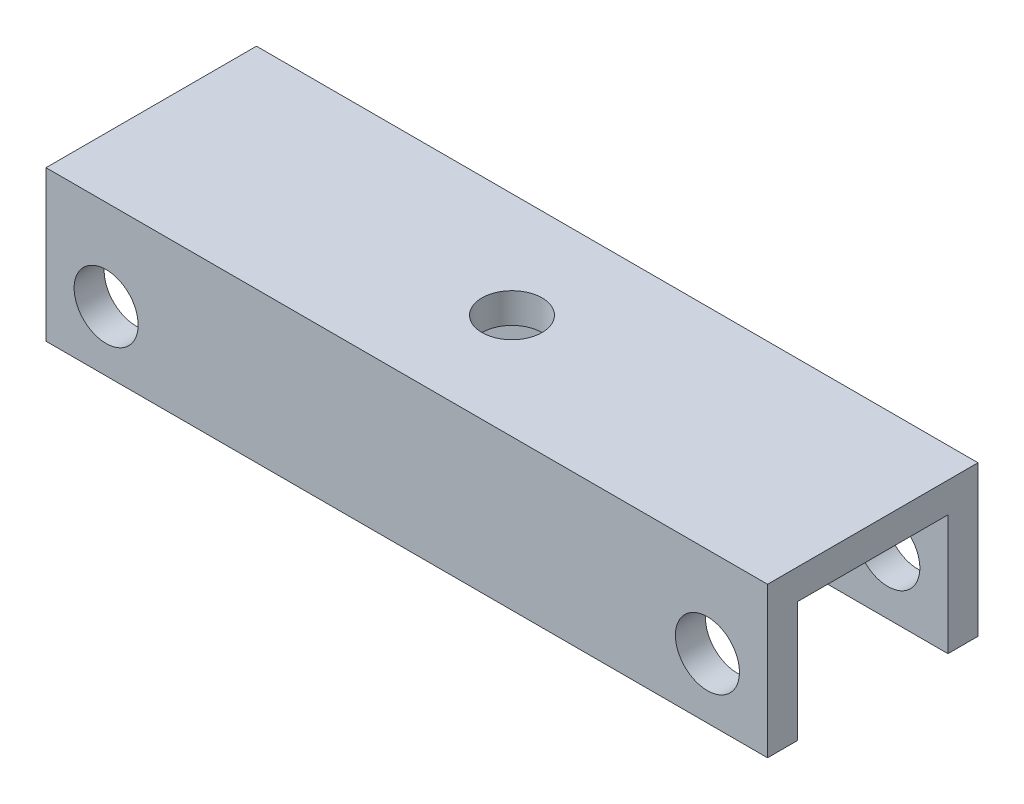
ISO-10303-21;
HEADER;
FILE_DESCRIPTION(('STEP AP214'),'2;1');
FILE_NAME('part.step','',(''),(''),'','','');
FILE_SCHEMA(('AUTOMOTIVE_DESIGN { 1 0 10303 214 1 1 1 1 }'));
ENDSEC;
DATA;
#1=APPLICATION_CONTEXT('core data for automotive mechanical design processes');
#2=APPLICATION_PROTOCOL_DEFINITION('international standard','automotive_design',2000,#1);
#3=PRODUCT_CONTEXT('',#1,'mechanical');
#4=PRODUCT('Part','Part','',(#3));
#5=PRODUCT_RELATED_PRODUCT_CATEGORY('part','',(#4));
#6=PRODUCT_DEFINITION_FORMATION('','',#4);
#7=PRODUCT_DEFINITION_CONTEXT('part definition',#1,'design');
#8=PRODUCT_DEFINITION('design','',#6,#7);
#9=PRODUCT_DEFINITION_SHAPE('','',#8);
#10=(LENGTH_UNIT() NAMED_UNIT(*) SI_UNIT(.MILLI.,.METRE.));
#11=(NAMED_UNIT(*) PLANE_ANGLE_UNIT() SI_UNIT($,.RADIAN.));
#12=(NAMED_UNIT(*) SI_UNIT($,.STERADIAN.) SOLID_ANGLE_UNIT());
#13=UNCERTAINTY_MEASURE_WITH_UNIT(LENGTH_MEASURE(1.E-05),#10,'distance_accuracy_value','');
#14=(GEOMETRIC_REPRESENTATION_CONTEXT(3) GLOBAL_UNCERTAINTY_ASSIGNED_CONTEXT((#13)) GLOBAL_UNIT_ASSIGNED_CONTEXT((#10,
#11,#12)) REPRESENTATION_CONTEXT('',''));
#15=CARTESIAN_POINT('',(0.,0.,0.));
#16=DIRECTION('',(0.,0.,1.));
#17=DIRECTION('',(1.,0.,0.));
#18=AXIS2_PLACEMENT_3D('',#15,#16,#17);
#19=CARTESIAN_POINT('',(152.4,-31.75,35.0487043256437));
#20=DIRECTION('',(0.,0.,-1.));
#21=DIRECTION('',(-1.,0.,0.));
#22=AXIS2_PLACEMENT_3D('',#19,#20,#21);
#23=PLANE('',#22);
#24=CARTESIAN_POINT('',(139.7,-19.05,35.0487043256437));
#25=DIRECTION('',(0.,0.,1.));
#26=DIRECTION('',(-1.,0.,0.));
#27=AXIS2_PLACEMENT_3D('',#24,#25,#26);
#28=CIRCLE('',#27,6.76325482614574);
#29=CARTESIAN_POINT('',(132.936745173854,-19.05,35.0487043256437));
#30=VERTEX_POINT('',#29);
#31=EDGE_CURVE('E200',#30,#30,#28,.T.);
#32=ORIENTED_EDGE('',*,*,#31,.F.);
#33=EDGE_LOOP('',(#32));
#34=FACE_BOUND('',#33,.T.);
#35=CARTESIAN_POINT('',(12.7,-19.05,35.0487043256437));
#36=DIRECTION('',(0.,0.,1.));
#37=DIRECTION('',(1.,0.,0.));
#38=AXIS2_PLACEMENT_3D('',#35,#36,#37);
#39=CIRCLE('',#38,6.76325482614575);
#40=CARTESIAN_POINT('',(19.4632548261458,-19.05,35.0487043256437));
#41=VERTEX_POINT('',#40);
#42=EDGE_CURVE('E188',#41,#41,#39,.T.);
#43=ORIENTED_EDGE('',*,*,#42,.F.);
#44=EDGE_LOOP('',(#43));
#45=FACE_BOUND('',#44,.T.);
#46=DIRECTION('',(0.,-1.,0.));
#47=VECTOR('',#46,1.);
#48=CARTESIAN_POINT('',(0.,-31.75,35.0487043256437));
#49=LINE('',#48,#47);
#50=CARTESIAN_POINT('',(0.,0.,35.0487043256437));
#51=VERTEX_POINT('',#50);
#52=CARTESIAN_POINT('',(0.,-31.75,35.0487043256437));
#53=VERTEX_POINT('',#52);
#54=EDGE_CURVE('E128',#51,#53,#49,.T.);
#55=ORIENTED_EDGE('',*,*,#54,.T.);
#56=DIRECTION('',(-1.,0.,0.));
#57=VECTOR('',#56,1.);
#58=CARTESIAN_POINT('',(152.4,-31.75,35.0487043256437));
#59=LINE('',#58,#57);
#60=CARTESIAN_POINT('',(152.4,-31.75,35.0487043256437));
#61=VERTEX_POINT('',#60);
#62=EDGE_CURVE('E11',#61,#53,#59,.T.);
#63=ORIENTED_EDGE('',*,*,#62,.F.);
#64=DIRECTION('',(0.,-1.,0.));
#65=VECTOR('',#64,1.);
#66=CARTESIAN_POINT('',(152.4,-31.75,35.0487043256437));
#67=LINE('',#66,#65);
#68=CARTESIAN_POINT('',(152.4,0.,35.0487043256437));
#69=VERTEX_POINT('',#68);
#70=EDGE_CURVE('E143',#69,#61,#67,.T.);
#71=ORIENTED_EDGE('',*,*,#70,.F.);
#72=DIRECTION('',(-1.,0.,0.));
#73=VECTOR('',#72,1.);
#74=CARTESIAN_POINT('',(152.4,0.,35.0487043256437));
#75=LINE('',#74,#73);
#76=EDGE_CURVE('E124',#69,#51,#75,.T.);
#77=ORIENTED_EDGE('',*,*,#76,.T.);
#78=EDGE_LOOP('',(#55,#63,#71,#77));
#79=FACE_BOUND('',#78,.T.);
#80=ADVANCED_FACE('F32',(#34,#45,#79),#23,.F.);
#81=CARTESIAN_POINT('',(152.4,-31.75,28.6987043256437));
#82=DIRECTION('',(0.,1.,0.));
#83=DIRECTION('',(0.,0.,1.));
#84=AXIS2_PLACEMENT_3D('',#81,#82,#83);
#85=PLANE('',#84);
#86=DIRECTION('',(0.,0.,-1.));
#87=VECTOR('',#86,1.);
#88=CARTESIAN_POINT('',(0.,-31.75,28.6987043256437));
#89=LINE('',#88,#87);
#90=CARTESIAN_POINT('',(0.,-31.75,28.6987043256437));
#91=VERTEX_POINT('',#90);
#92=EDGE_CURVE('E131',#53,#91,#89,.T.);
#93=ORIENTED_EDGE('',*,*,#92,.T.);
#94=DIRECTION('',(-1.,0.,0.));
#95=VECTOR('',#94,1.);
#96=CARTESIAN_POINT('',(152.4,-31.75,28.6987043256437));
#97=LINE('',#96,#95);
#98=CARTESIAN_POINT('',(152.4,-31.75,28.6987043256437));
#99=VERTEX_POINT('',#98);
#100=EDGE_CURVE('E40',#99,#91,#97,.T.);
#101=ORIENTED_EDGE('',*,*,#100,.F.);
#102=DIRECTION('',(0.,0.,-1.));
#103=VECTOR('',#102,1.);
#104=CARTESIAN_POINT('',(152.4,-31.75,28.6987043256437));
#105=LINE('',#104,#103);
#106=EDGE_CURVE('E91',#61,#99,#105,.T.);
#107=ORIENTED_EDGE('',*,*,#106,.F.);
#108=ORIENTED_EDGE('',*,*,#62,.T.);
#109=EDGE_LOOP('',(#93,#101,#107,#108));
#110=FACE_BOUND('',#109,.T.);
#111=ADVANCED_FACE('F235',(#110),#85,.F.);
#112=CARTESIAN_POINT('',(152.4,-6.35,28.6987043256437));
#113=DIRECTION('',(0.,0.,1.));
#114=DIRECTION('',(1.,0.,0.));
#115=AXIS2_PLACEMENT_3D('',#112,#113,#114);
#116=PLANE('',#115);
#117=CARTESIAN_POINT('',(139.7,-19.05,28.6987043256437));
#118=DIRECTION('',(0.,0.,1.));
#119=DIRECTION('',(1.,0.,0.));
#120=AXIS2_PLACEMENT_3D('',#117,#118,#119);
#121=CIRCLE('',#120,6.76325482614574);
#122=CARTESIAN_POINT('',(146.463254826146,-19.05,28.6987043256437));
#123=VERTEX_POINT('',#122);
#124=EDGE_CURVE('E191',#123,#123,#121,.T.);
#125=ORIENTED_EDGE('',*,*,#124,.T.);
#126=EDGE_LOOP('',(#125));
#127=FACE_BOUND('',#126,.T.);
#128=CARTESIAN_POINT('',(12.7,-19.05,28.6987043256437));
#129=DIRECTION('',(0.,0.,1.));
#130=DIRECTION('',(1.,0.,0.));
#131=AXIS2_PLACEMENT_3D('',#128,#129,#130);
#132=CIRCLE('',#131,6.76325482614575);
#133=CARTESIAN_POINT('',(19.4632548261458,-19.05,28.6987043256437));
#134=VERTEX_POINT('',#133);
#135=EDGE_CURVE('E181',#134,#134,#132,.T.);
#136=ORIENTED_EDGE('',*,*,#135,.T.);
#137=EDGE_LOOP('',(#136));
#138=FACE_BOUND('',#137,.T.);
#139=DIRECTION('',(0.,1.,0.));
#140=VECTOR('',#139,1.);
#141=CARTESIAN_POINT('',(0.,-6.35,28.6987043256437));
#142=LINE('',#141,#140);
#143=CARTESIAN_POINT('',(0.,-6.35,28.6987043256437));
#144=VERTEX_POINT('',#143);
#145=EDGE_CURVE('E134',#91,#144,#142,.T.);
#146=ORIENTED_EDGE('',*,*,#145,.T.);
#147=DIRECTION('',(-1.,0.,0.));
#148=VECTOR('',#147,1.);
#149=CARTESIAN_POINT('',(152.4,-6.35,28.6987043256437));
#150=LINE('',#149,#148);
#151=CARTESIAN_POINT('',(152.4,-6.35,28.6987043256437));
#152=VERTEX_POINT('',#151);
#153=EDGE_CURVE('E150',#152,#144,#150,.T.);
#154=ORIENTED_EDGE('',*,*,#153,.F.);
#155=DIRECTION('',(0.,1.,0.));
#156=VECTOR('',#155,1.);
#157=CARTESIAN_POINT('',(152.4,-6.35,28.6987043256437));
#158=LINE('',#157,#156);
#159=EDGE_CURVE('E158',#99,#152,#158,.T.);
#160=ORIENTED_EDGE('',*,*,#159,.F.);
#161=ORIENTED_EDGE('',*,*,#100,.T.);
#162=EDGE_LOOP('',(#146,#154,#160,#161));
#163=FACE_BOUND('',#162,.T.);
#164=ADVANCED_FACE('F156',(#127,#138,#163),#116,.F.);
#165=CARTESIAN_POINT('',(152.4,-6.35,-3.05129567435631));
#166=DIRECTION('',(0.,1.,0.));
#167=DIRECTION('',(0.,0.,1.));
#168=AXIS2_PLACEMENT_3D('',#165,#166,#167);
#169=PLANE('',#168);
#170=CARTESIAN_POINT('',(76.2,-6.35,12.8237043256437));
#171=DIRECTION('',(0.,1.,0.));
#172=DIRECTION('',(0.,0.,1.));
#173=AXIS2_PLACEMENT_3D('',#170,#171,#172);
#174=CIRCLE('',#173,6.35);
#175=CARTESIAN_POINT('',(76.2,-6.35000000000001,19.1737043256437));
#176=VERTEX_POINT('',#175);
#177=EDGE_CURVE('E132',#176,#176,#174,.F.);
#178=ORIENTED_EDGE('',*,*,#177,.F.);
#179=EDGE_LOOP('',(#178));
#180=FACE_BOUND('',#179,.T.);
#181=DIRECTION('',(0.,0.,-1.));
#182=VECTOR('',#181,1.);
#183=CARTESIAN_POINT('',(0.,-6.35,-3.05129567435631));
#184=LINE('',#183,#182);
#185=CARTESIAN_POINT('',(0.,-6.35,-3.05129567435631));
#186=VERTEX_POINT('',#185);
#187=EDGE_CURVE('E136',#144,#186,#184,.T.);
#188=ORIENTED_EDGE('',*,*,#187,.T.);
#189=DIRECTION('',(-1.,0.,0.));
#190=VECTOR('',#189,1.);
#191=CARTESIAN_POINT('',(152.4,-6.35,-3.05129567435631));
#192=LINE('',#191,#190);
#193=CARTESIAN_POINT('',(152.4,-6.35,-3.05129567435631));
#194=VERTEX_POINT('',#193);
#195=EDGE_CURVE('E147',#194,#186,#192,.T.);
#196=ORIENTED_EDGE('',*,*,#195,.F.);
#197=DIRECTION('',(0.,0.,-1.));
#198=VECTOR('',#197,1.);
#199=CARTESIAN_POINT('',(152.4,-6.35,-3.05129567435631));
#200=LINE('',#199,#198);
#201=EDGE_CURVE('E170',#152,#194,#200,.T.);
#202=ORIENTED_EDGE('',*,*,#201,.F.);
#203=ORIENTED_EDGE('',*,*,#153,.T.);
#204=EDGE_LOOP('',(#188,#196,#202,#203));
#205=FACE_BOUND('',#204,.T.);
#206=ADVANCED_FACE('F166',(#180,#205),#169,.F.);
#207=CARTESIAN_POINT('',(152.4,-31.75,-3.05129567435631));
#208=DIRECTION('',(0.,0.,-1.));
#209=DIRECTION('',(-1.,0.,0.));
#210=AXIS2_PLACEMENT_3D('',#207,#208,#209);
#211=PLANE('',#210);
#212=CARTESIAN_POINT('',(139.7,-19.05,-3.05129567435631));
#213=DIRECTION('',(0.,0.,-1.));
#214=DIRECTION('',(-1.,0.,0.));
#215=AXIS2_PLACEMENT_3D('',#212,#213,#214);
#216=CIRCLE('',#215,6.76325482614574);
#217=CARTESIAN_POINT('',(132.936745173854,-19.05,-3.05129567435631));
#218=VERTEX_POINT('',#217);
#219=EDGE_CURVE('E196',#218,#218,#216,.T.);
#220=ORIENTED_EDGE('',*,*,#219,.T.);
#221=EDGE_LOOP('',(#220));
#222=FACE_BOUND('',#221,.T.);
#223=CARTESIAN_POINT('',(12.7,-19.05,-3.05129567435631));
#224=DIRECTION('',(0.,0.,-1.));
#225=DIRECTION('',(-1.,0.,0.));
#226=AXIS2_PLACEMENT_3D('',#223,#224,#225);
#227=CIRCLE('',#226,6.76325482614575);
#228=CARTESIAN_POINT('',(5.93674517385425,-19.05,-3.05129567435631));
#229=VERTEX_POINT('',#228);
#230=EDGE_CURVE('E184',#229,#229,#227,.T.);
#231=ORIENTED_EDGE('',*,*,#230,.T.);
#232=EDGE_LOOP('',(#231));
#233=FACE_BOUND('',#232,.T.);
#234=DIRECTION('',(0.,-1.,0.));
#235=VECTOR('',#234,1.);
#236=CARTESIAN_POINT('',(0.,-31.75,-3.05129567435631));
#237=LINE('',#236,#235);
#238=CARTESIAN_POINT('',(0.,-31.75,-3.05129567435631));
#239=VERTEX_POINT('',#238);
#240=EDGE_CURVE('E138',#186,#239,#237,.T.);
#241=ORIENTED_EDGE('',*,*,#240,.T.);
#242=DIRECTION('',(-1.,0.,0.));
#243=VECTOR('',#242,1.);
#244=CARTESIAN_POINT('',(152.4,-31.75,-3.05129567435631));
#245=LINE('',#244,#243);
#246=CARTESIAN_POINT('',(152.4,-31.75,-3.05129567435631));
#247=VERTEX_POINT('',#246);
#248=EDGE_CURVE('E119',#247,#239,#245,.T.);
#249=ORIENTED_EDGE('',*,*,#248,.F.);
#250=DIRECTION('',(0.,-1.,0.));
#251=VECTOR('',#250,1.);
#252=CARTESIAN_POINT('',(152.4,-31.75,-3.05129567435631));
#253=LINE('',#252,#251);
#254=EDGE_CURVE('E110',#194,#247,#253,.T.);
#255=ORIENTED_EDGE('',*,*,#254,.F.);
#256=ORIENTED_EDGE('',*,*,#195,.T.);
#257=EDGE_LOOP('',(#241,#249,#255,#256));
#258=FACE_BOUND('',#257,.T.);
#259=ADVANCED_FACE('F169',(#222,#233,#258),#211,.F.);
#260=CARTESIAN_POINT('',(152.4,-31.75,-9.40129567435631));
#261=DIRECTION('',(0.,1.,0.));
#262=DIRECTION('',(0.,0.,1.));
#263=AXIS2_PLACEMENT_3D('',#260,#261,#262);
#264=PLANE('',#263);
#265=DIRECTION('',(0.,0.,-1.));
#266=VECTOR('',#265,1.);
#267=CARTESIAN_POINT('',(0.,-31.75,-9.40129567435631));
#268=LINE('',#267,#266);
#269=CARTESIAN_POINT('',(0.,-31.75,-9.40129567435631));
#270=VERTEX_POINT('',#269);
#271=EDGE_CURVE('E118',#239,#270,#268,.T.);
#272=ORIENTED_EDGE('',*,*,#271,.T.);
#273=DIRECTION('',(-1.,0.,0.));
#274=VECTOR('',#273,1.);
#275=CARTESIAN_POINT('',(152.4,-31.75,-9.40129567435631));
#276=LINE('',#275,#274);
#277=CARTESIAN_POINT('',(152.4,-31.75,-9.40129567435631));
#278=VERTEX_POINT('',#277);
#279=EDGE_CURVE('E115',#278,#270,#276,.T.);
#280=ORIENTED_EDGE('',*,*,#279,.F.);
#281=DIRECTION('',(0.,0.,-1.));
#282=VECTOR('',#281,1.);
#283=CARTESIAN_POINT('',(152.4,-31.75,-9.40129567435631));
#284=LINE('',#283,#282);
#285=EDGE_CURVE('E104',#247,#278,#284,.T.);
#286=ORIENTED_EDGE('',*,*,#285,.F.);
#287=ORIENTED_EDGE('',*,*,#248,.T.);
#288=EDGE_LOOP('',(#272,#280,#286,#287));
#289=FACE_BOUND('',#288,.T.);
#290=ADVANCED_FACE('F116',(#289),#264,.F.);
#291=CARTESIAN_POINT('',(152.4,0.,-9.4012956743563));
#292=DIRECTION('',(0.,0.,1.));
#293=DIRECTION('',(0.,-1.,0.));
#294=AXIS2_PLACEMENT_3D('',#291,#292,#293);
#295=PLANE('',#294);
#296=CARTESIAN_POINT('',(139.7,-19.05,-9.40129567435631));
#297=DIRECTION('',(0.,0.,1.));
#298=DIRECTION('',(-1.,0.,0.));
#299=AXIS2_PLACEMENT_3D('',#296,#297,#298);
#300=CIRCLE('',#299,6.76325482614574);
#301=CARTESIAN_POINT('',(132.936745173854,-19.05,-9.40129567435631));
#302=VERTEX_POINT('',#301);
#303=EDGE_CURVE('E199',#302,#302,#300,.T.);
#304=ORIENTED_EDGE('',*,*,#303,.T.);
#305=EDGE_LOOP('',(#304));
#306=FACE_BOUND('',#305,.T.);
#307=CARTESIAN_POINT('',(12.7,-19.05,-9.40129567435631));
#308=DIRECTION('',(0.,0.,1.));
#309=DIRECTION('',(1.,0.,0.));
#310=AXIS2_PLACEMENT_3D('',#307,#308,#309);
#311=CIRCLE('',#310,6.76325482614575);
#312=CARTESIAN_POINT('',(19.4632548261458,-19.05,-9.40129567435631));
#313=VERTEX_POINT('',#312);
#314=EDGE_CURVE('E187',#313,#313,#311,.T.);
#315=ORIENTED_EDGE('',*,*,#314,.T.);
#316=EDGE_LOOP('',(#315));
#317=FACE_BOUND('',#316,.T.);
#318=DIRECTION('',(0.,1.,0.));
#319=VECTOR('',#318,1.);
#320=CARTESIAN_POINT('',(0.,0.,-9.4012956743563));
#321=LINE('',#320,#319);
#322=CARTESIAN_POINT('',(0.,0.,-9.4012956743563));
#323=VERTEX_POINT('',#322);
#324=EDGE_CURVE('E77',#270,#323,#321,.T.);
#325=ORIENTED_EDGE('',*,*,#324,.T.);
#326=DIRECTION('',(-1.,0.,0.));
#327=VECTOR('',#326,1.);
#328=CARTESIAN_POINT('',(152.4,0.,-9.4012956743563));
#329=LINE('',#328,#327);
#330=CARTESIAN_POINT('',(152.4,0.,-9.4012956743563));
#331=VERTEX_POINT('',#330);
#332=EDGE_CURVE('E120',#331,#323,#329,.T.);
#333=ORIENTED_EDGE('',*,*,#332,.F.);
#334=DIRECTION('',(0.,1.,0.));
#335=VECTOR('',#334,1.);
#336=CARTESIAN_POINT('',(152.4,0.,-9.4012956743563));
#337=LINE('',#336,#335);
#338=EDGE_CURVE('E108',#278,#331,#337,.T.);
#339=ORIENTED_EDGE('',*,*,#338,.F.);
#340=ORIENTED_EDGE('',*,*,#279,.T.);
#341=EDGE_LOOP('',(#325,#333,#339,#340));
#342=FACE_BOUND('',#341,.T.);
#343=ADVANCED_FACE('F122',(#306,#317,#342),#295,.F.);
#344=CARTESIAN_POINT('',(152.4,0.,35.0487043256437));
#345=DIRECTION('',(0.,-1.,0.));
#346=DIRECTION('',(0.,0.,-1.));
#347=AXIS2_PLACEMENT_3D('',#344,#345,#346);
#348=PLANE('',#347);
#349=CARTESIAN_POINT('',(76.2,0.,12.8237043256437));
#350=DIRECTION('',(0.,1.,0.));
#351=DIRECTION('',(0.,0.,1.));
#352=AXIS2_PLACEMENT_3D('',#349,#350,#351);
#353=CIRCLE('',#352,6.35);
#354=CARTESIAN_POINT('',(76.2,0.,19.1737043256437));
#355=VERTEX_POINT('',#354);
#356=EDGE_CURVE('E178',#355,#355,#353,.T.);
#357=ORIENTED_EDGE('',*,*,#356,.F.);
#358=EDGE_LOOP('',(#357));
#359=FACE_BOUND('',#358,.T.);
#360=DIRECTION('',(0.,0.,1.));
#361=VECTOR('',#360,1.);
#362=CARTESIAN_POINT('',(0.,0.,35.0487043256437));
#363=LINE('',#362,#361);
#364=EDGE_CURVE('E83',#323,#51,#363,.T.);
#365=ORIENTED_EDGE('',*,*,#364,.T.);
#366=ORIENTED_EDGE('',*,*,#76,.F.);
#367=DIRECTION('',(0.,0.,1.));
#368=VECTOR('',#367,1.);
#369=CARTESIAN_POINT('',(152.4,0.,35.0487043256437));
#370=LINE('',#369,#368);
#371=EDGE_CURVE('E48',#331,#69,#370,.T.);
#372=ORIENTED_EDGE('',*,*,#371,.F.);
#373=ORIENTED_EDGE('',*,*,#332,.T.);
#374=EDGE_LOOP('',(#365,#366,#372,#373));
#375=FACE_BOUND('',#374,.T.);
#376=ADVANCED_FACE('F246',(#359,#375),#348,.F.);
#377=CARTESIAN_POINT('',(152.4,0.,35.0487043256437));
#378=DIRECTION('',(-1.,0.,0.));
#379=DIRECTION('',(0.,0.,1.));
#380=AXIS2_PLACEMENT_3D('',#377,#378,#379);
#381=PLANE('',#380);
#382=ORIENTED_EDGE('',*,*,#70,.T.);
#383=ORIENTED_EDGE('',*,*,#106,.T.);
#384=ORIENTED_EDGE('',*,*,#159,.T.);
#385=ORIENTED_EDGE('',*,*,#201,.T.);
#386=ORIENTED_EDGE('',*,*,#254,.T.);
#387=ORIENTED_EDGE('',*,*,#285,.T.);
#388=ORIENTED_EDGE('',*,*,#338,.T.);
#389=ORIENTED_EDGE('',*,*,#371,.T.);
#390=EDGE_LOOP('',(#382,#383,#384,#385,#386,#387,#388,#389));
#391=FACE_BOUND('',#390,.T.);
#392=ADVANCED_FACE('F106',(#391),#381,.F.);
#393=CARTESIAN_POINT('',(0.,0.,35.0487043256437));
#394=DIRECTION('',(-1.,0.,0.));
#395=DIRECTION('',(0.,0.,1.));
#396=AXIS2_PLACEMENT_3D('',#393,#394,#395);
#397=PLANE('',#396);
#398=ORIENTED_EDGE('',*,*,#54,.F.);
#399=ORIENTED_EDGE('',*,*,#364,.F.);
#400=ORIENTED_EDGE('',*,*,#324,.F.);
#401=ORIENTED_EDGE('',*,*,#271,.F.);
#402=ORIENTED_EDGE('',*,*,#240,.F.);
#403=ORIENTED_EDGE('',*,*,#187,.F.);
#404=ORIENTED_EDGE('',*,*,#145,.F.);
#405=ORIENTED_EDGE('',*,*,#92,.F.);
#406=EDGE_LOOP('',(#398,#399,#400,#401,#402,#403,#404,#405));
#407=FACE_BOUND('',#406,.T.);
#408=ADVANCED_FACE('F162',(#407),#397,.T.);
#409=CARTESIAN_POINT('',(76.2,-31.751,12.8237043256437));
#410=DIRECTION('',(0.,1.,0.));
#411=DIRECTION('',(0.,0.,1.));
#412=AXIS2_PLACEMENT_3D('',#409,#410,#411);
#413=CYLINDRICAL_SURFACE('',#412,6.35);
#414=ORIENTED_EDGE('',*,*,#356,.T.);
#415=EDGE_LOOP('',(#414));
#416=FACE_BOUND('',#415,.T.);
#417=ORIENTED_EDGE('',*,*,#177,.T.);
#418=EDGE_LOOP('',(#417));
#419=FACE_BOUND('',#418,.T.);
#420=ADVANCED_FACE('F223',(#416,#419),#413,.F.);
#421=CARTESIAN_POINT('',(12.7,-19.05,-9.40129567435631));
#422=DIRECTION('',(0.,0.,1.));
#423=DIRECTION('',(1.,0.,0.));
#424=AXIS2_PLACEMENT_3D('',#421,#422,#423);
#425=CYLINDRICAL_SURFACE('',#424,6.76325482614575);
#426=ORIENTED_EDGE('',*,*,#314,.F.);
#427=EDGE_LOOP('',(#426));
#428=FACE_BOUND('',#427,.T.);
#429=ORIENTED_EDGE('',*,*,#230,.F.);
#430=EDGE_LOOP('',(#429));
#431=FACE_BOUND('',#430,.T.);
#432=ADVANCED_FACE('F221',(#428,#431),#425,.F.);
#433=ORIENTED_EDGE('',*,*,#42,.T.);
#434=EDGE_LOOP('',(#433));
#435=FACE_BOUND('',#434,.T.);
#436=ORIENTED_EDGE('',*,*,#135,.F.);
#437=EDGE_LOOP('',(#436));
#438=FACE_BOUND('',#437,.T.);
#439=ADVANCED_FACE('F212',(#435,#438),#425,.F.);
#440=CARTESIAN_POINT('',(139.7,-19.05,-9.40129567435631));
#441=DIRECTION('',(0.,0.,1.));
#442=DIRECTION('',(1.,0.,0.));
#443=AXIS2_PLACEMENT_3D('',#440,#441,#442);
#444=CYLINDRICAL_SURFACE('',#443,6.76325482614574);
#445=ORIENTED_EDGE('',*,*,#303,.F.);
#446=EDGE_LOOP('',(#445));
#447=FACE_BOUND('',#446,.T.);
#448=ORIENTED_EDGE('',*,*,#219,.F.);
#449=EDGE_LOOP('',(#448));
#450=FACE_BOUND('',#449,.T.);
#451=ADVANCED_FACE('F208',(#447,#450),#444,.F.);
#452=ORIENTED_EDGE('',*,*,#31,.T.);
#453=EDGE_LOOP('',(#452));
#454=FACE_BOUND('',#453,.T.);
#455=ORIENTED_EDGE('',*,*,#124,.F.);
#456=EDGE_LOOP('',(#455));
#457=FACE_BOUND('',#456,.T.);
#458=ADVANCED_FACE('F211',(#454,#457),#444,.F.);
#459=CLOSED_SHELL('',(#80,#111,#164,#206,#259,#290,#343,#376,#392,#408,#420,#432,#439,#451,#458));
#460=MANIFOLD_SOLID_BREP('B2',#459);
#461=ADVANCED_BREP_SHAPE_REPRESENTATION('',(#18,#460),#14);
#462=SHAPE_DEFINITION_REPRESENTATION(#9,#461);
ENDSEC;
END-ISO-10303-21;
